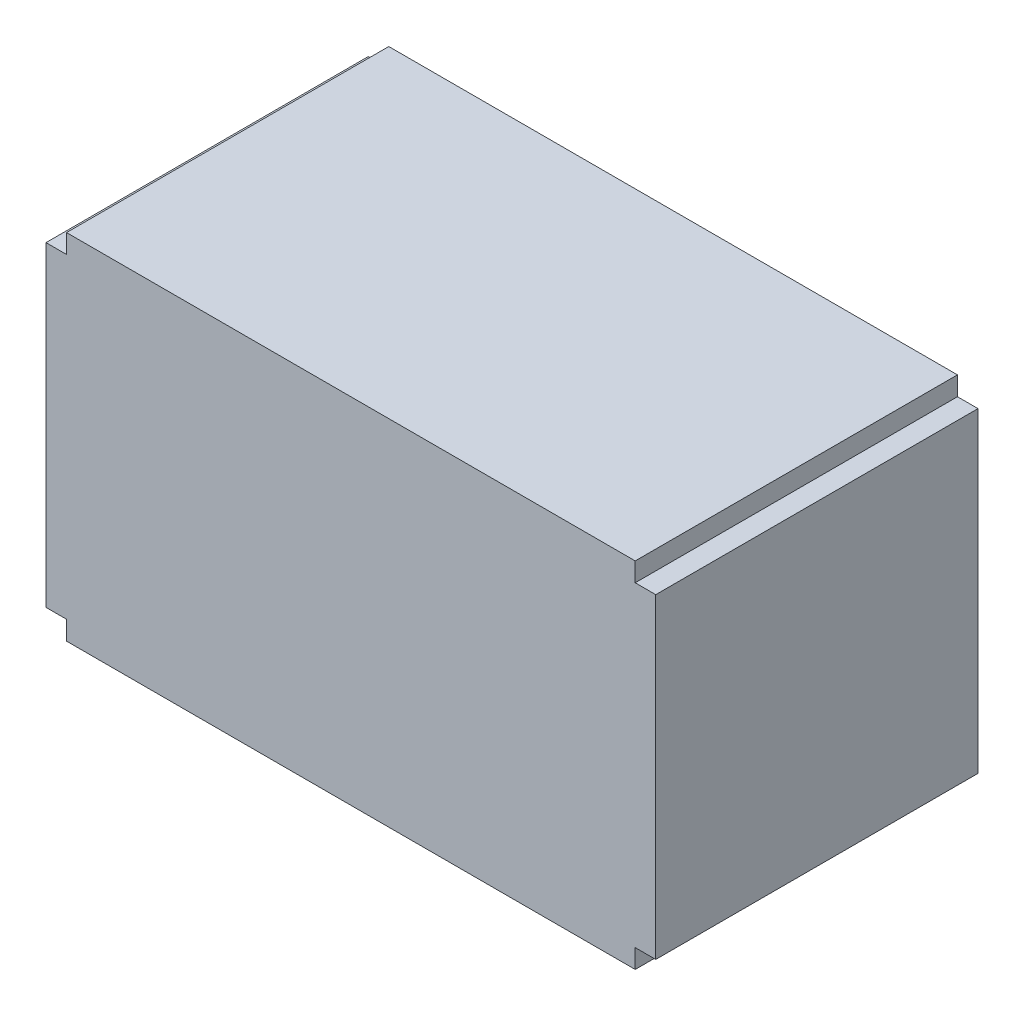
ISO-10303-21;
HEADER;
FILE_DESCRIPTION(('STEP AP214'),'2;1');
FILE_NAME('part.step','',(''),(''),'','','');
FILE_SCHEMA(('AUTOMOTIVE_DESIGN { 1 0 10303 214 1 1 1 1 }'));
ENDSEC;
DATA;
#1=APPLICATION_CONTEXT('core data for automotive mechanical design processes');
#2=APPLICATION_PROTOCOL_DEFINITION('international standard','automotive_design',2000,#1);
#3=PRODUCT_CONTEXT('',#1,'mechanical');
#4=PRODUCT('Part','Part','',(#3));
#5=PRODUCT_RELATED_PRODUCT_CATEGORY('part','',(#4));
#6=PRODUCT_DEFINITION_FORMATION('','',#4);
#7=PRODUCT_DEFINITION_CONTEXT('part definition',#1,'design');
#8=PRODUCT_DEFINITION('design','',#6,#7);
#9=PRODUCT_DEFINITION_SHAPE('','',#8);
#10=(LENGTH_UNIT() NAMED_UNIT(*) SI_UNIT(.MILLI.,.METRE.));
#11=(NAMED_UNIT(*) PLANE_ANGLE_UNIT() SI_UNIT($,.RADIAN.));
#12=(NAMED_UNIT(*) SI_UNIT($,.STERADIAN.) SOLID_ANGLE_UNIT());
#13=UNCERTAINTY_MEASURE_WITH_UNIT(LENGTH_MEASURE(1.E-05),#10,'distance_accuracy_value','');
#14=(GEOMETRIC_REPRESENTATION_CONTEXT(3) GLOBAL_UNCERTAINTY_ASSIGNED_CONTEXT((#13)) GLOBAL_UNIT_ASSIGNED_CONTEXT((#10,
#11,#12)) REPRESENTATION_CONTEXT('',''));
#15=CARTESIAN_POINT('',(0.,0.,0.));
#16=DIRECTION('',(0.,0.,1.));
#17=DIRECTION('',(1.,0.,0.));
#18=AXIS2_PLACEMENT_3D('',#15,#16,#17);
#19=CARTESIAN_POINT('',(0.965,0.5,1.02));
#20=DIRECTION('',(-1.,0.,0.));
#21=DIRECTION('',(0.,0.,1.));
#22=AXIS2_PLACEMENT_3D('',#19,#20,#21);
#23=PLANE('',#22);
#24=DIRECTION('',(0.,1.,0.));
#25=VECTOR('',#24,1.);
#26=CARTESIAN_POINT('',(0.965,0.5,0.));
#27=LINE('',#26,#25);
#28=CARTESIAN_POINT('',(0.965,-0.5,0.));
#29=VERTEX_POINT('',#28);
#30=CARTESIAN_POINT('',(0.965,0.5,0.));
#31=VERTEX_POINT('',#30);
#32=EDGE_CURVE('E154',#29,#31,#27,.T.);
#33=ORIENTED_EDGE('',*,*,#32,.T.);
#34=DIRECTION('',(0.,0.,-1.));
#35=VECTOR('',#34,1.);
#36=CARTESIAN_POINT('',(0.965,0.5,1.02));
#37=LINE('',#36,#35);
#38=CARTESIAN_POINT('',(0.965,0.5,1.02));
#39=VERTEX_POINT('',#38);
#40=EDGE_CURVE('E11',#39,#31,#37,.T.);
#41=ORIENTED_EDGE('',*,*,#40,.F.);
#42=DIRECTION('',(0.,1.,0.));
#43=VECTOR('',#42,1.);
#44=CARTESIAN_POINT('',(0.965,0.5,1.02));
#45=LINE('',#44,#43);
#46=CARTESIAN_POINT('',(0.965,-0.5,1.02));
#47=VERTEX_POINT('',#46);
#48=EDGE_CURVE('E176',#47,#39,#45,.T.);
#49=ORIENTED_EDGE('',*,*,#48,.F.);
#50=DIRECTION('',(0.,0.,-1.));
#51=VECTOR('',#50,1.);
#52=CARTESIAN_POINT('',(0.965,-0.5,1.02));
#53=LINE('',#52,#51);
#54=EDGE_CURVE('E150',#47,#29,#53,.T.);
#55=ORIENTED_EDGE('',*,*,#54,.T.);
#56=EDGE_LOOP('',(#33,#41,#49,#55));
#57=FACE_BOUND('',#56,.T.);
#58=ADVANCED_FACE('F34',(#57),#23,.F.);
#59=CARTESIAN_POINT('',(0.9,0.5,1.02));
#60=DIRECTION('',(0.,-1.,0.));
#61=DIRECTION('',(0.,0.,-1.));
#62=AXIS2_PLACEMENT_3D('',#59,#60,#61);
#63=PLANE('',#62);
#64=DIRECTION('',(-1.,0.,0.));
#65=VECTOR('',#64,1.);
#66=CARTESIAN_POINT('',(0.9,0.5,0.));
#67=LINE('',#66,#65);
#68=CARTESIAN_POINT('',(0.9,0.5,0.));
#69=VERTEX_POINT('',#68);
#70=EDGE_CURVE('E157',#31,#69,#67,.T.);
#71=ORIENTED_EDGE('',*,*,#70,.T.);
#72=DIRECTION('',(0.,0.,-1.));
#73=VECTOR('',#72,1.);
#74=CARTESIAN_POINT('',(0.9,0.5,1.02));
#75=LINE('',#74,#73);
#76=CARTESIAN_POINT('',(0.9,0.5,1.02));
#77=VERTEX_POINT('',#76);
#78=EDGE_CURVE('E42',#77,#69,#75,.T.);
#79=ORIENTED_EDGE('',*,*,#78,.F.);
#80=DIRECTION('',(-1.,0.,0.));
#81=VECTOR('',#80,1.);
#82=CARTESIAN_POINT('',(0.9,0.5,1.02));
#83=LINE('',#82,#81);
#84=EDGE_CURVE('E105',#39,#77,#83,.T.);
#85=ORIENTED_EDGE('',*,*,#84,.F.);
#86=ORIENTED_EDGE('',*,*,#40,.T.);
#87=EDGE_LOOP('',(#71,#79,#85,#86));
#88=FACE_BOUND('',#87,.T.);
#89=ADVANCED_FACE('F254',(#88),#63,.F.);
#90=CARTESIAN_POINT('',(0.9,0.56,1.02));
#91=DIRECTION('',(-1.,0.,0.));
#92=DIRECTION('',(0.,0.,1.));
#93=AXIS2_PLACEMENT_3D('',#90,#91,#92);
#94=PLANE('',#93);
#95=DIRECTION('',(0.,1.,0.));
#96=VECTOR('',#95,1.);
#97=CARTESIAN_POINT('',(0.9,0.56,0.));
#98=LINE('',#97,#96);
#99=CARTESIAN_POINT('',(0.9,0.56,0.));
#100=VERTEX_POINT('',#99);
#101=EDGE_CURVE('E159',#69,#100,#98,.T.);
#102=ORIENTED_EDGE('',*,*,#101,.T.);
#103=DIRECTION('',(0.,0.,-1.));
#104=VECTOR('',#103,1.);
#105=CARTESIAN_POINT('',(0.9,0.56,1.02));
#106=LINE('',#105,#104);
#107=CARTESIAN_POINT('',(0.9,0.56,1.02));
#108=VERTEX_POINT('',#107);
#109=EDGE_CURVE('E195',#108,#100,#106,.T.);
#110=ORIENTED_EDGE('',*,*,#109,.F.);
#111=DIRECTION('',(0.,1.,0.));
#112=VECTOR('',#111,1.);
#113=CARTESIAN_POINT('',(0.9,0.56,1.02));
#114=LINE('',#113,#112);
#115=EDGE_CURVE('E203',#77,#108,#114,.T.);
#116=ORIENTED_EDGE('',*,*,#115,.F.);
#117=ORIENTED_EDGE('',*,*,#78,.T.);
#118=EDGE_LOOP('',(#102,#110,#116,#117));
#119=FACE_BOUND('',#118,.T.);
#120=ADVANCED_FACE('F201',(#119),#94,.F.);
#121=CARTESIAN_POINT('',(-0.9,0.56,1.02));
#122=DIRECTION('',(0.,-1.,0.));
#123=DIRECTION('',(0.,0.,-1.));
#124=AXIS2_PLACEMENT_3D('',#121,#122,#123);
#125=PLANE('',#124);
#126=DIRECTION('',(-1.,0.,0.));
#127=VECTOR('',#126,1.);
#128=CARTESIAN_POINT('',(-0.9,0.56,0.));
#129=LINE('',#128,#127);
#130=CARTESIAN_POINT('',(-0.9,0.56,0.));
#131=VERTEX_POINT('',#130);
#132=EDGE_CURVE('E161',#100,#131,#129,.T.);
#133=ORIENTED_EDGE('',*,*,#132,.T.);
#134=DIRECTION('',(0.,0.,-1.));
#135=VECTOR('',#134,1.);
#136=CARTESIAN_POINT('',(-0.9,0.56,1.02));
#137=LINE('',#136,#135);
#138=CARTESIAN_POINT('',(-0.9,0.56,1.02));
#139=VERTEX_POINT('',#138);
#140=EDGE_CURVE('E192',#139,#131,#137,.T.);
#141=ORIENTED_EDGE('',*,*,#140,.F.);
#142=DIRECTION('',(-1.,0.,0.));
#143=VECTOR('',#142,1.);
#144=CARTESIAN_POINT('',(-0.9,0.56,1.02));
#145=LINE('',#144,#143);
#146=EDGE_CURVE('E221',#108,#139,#145,.T.);
#147=ORIENTED_EDGE('',*,*,#146,.F.);
#148=ORIENTED_EDGE('',*,*,#109,.T.);
#149=EDGE_LOOP('',(#133,#141,#147,#148));
#150=FACE_BOUND('',#149,.T.);
#151=ADVANCED_FACE('F212',(#150),#125,.F.);
#152=CARTESIAN_POINT('',(-0.9,0.5,1.02));
#153=DIRECTION('',(1.,0.,0.));
#154=DIRECTION('',(0.,0.,-1.));
#155=AXIS2_PLACEMENT_3D('',#152,#153,#154);
#156=PLANE('',#155);
#157=DIRECTION('',(0.,-1.,0.));
#158=VECTOR('',#157,1.);
#159=CARTESIAN_POINT('',(-0.9,0.5,0.));
#160=LINE('',#159,#158);
#161=CARTESIAN_POINT('',(-0.9,0.5,0.));
#162=VERTEX_POINT('',#161);
#163=EDGE_CURVE('E163',#131,#162,#160,.T.);
#164=ORIENTED_EDGE('',*,*,#163,.T.);
#165=DIRECTION('',(0.,0.,-1.));
#166=VECTOR('',#165,1.);
#167=CARTESIAN_POINT('',(-0.9,0.5,1.02));
#168=LINE('',#167,#166);
#169=CARTESIAN_POINT('',(-0.9,0.5,1.02));
#170=VERTEX_POINT('',#169);
#171=EDGE_CURVE('E189',#170,#162,#168,.T.);
#172=ORIENTED_EDGE('',*,*,#171,.F.);
#173=DIRECTION('',(0.,-1.,0.));
#174=VECTOR('',#173,1.);
#175=CARTESIAN_POINT('',(-0.9,0.5,1.02));
#176=LINE('',#175,#174);
#177=EDGE_CURVE('E218',#139,#170,#176,.T.);
#178=ORIENTED_EDGE('',*,*,#177,.F.);
#179=ORIENTED_EDGE('',*,*,#140,.T.);
#180=EDGE_LOOP('',(#164,#172,#178,#179));
#181=FACE_BOUND('',#180,.T.);
#182=ADVANCED_FACE('F216',(#181),#156,.F.);
#183=CARTESIAN_POINT('',(-0.965,0.5,1.02));
#184=DIRECTION('',(0.,-1.,0.));
#185=DIRECTION('',(0.,0.,-1.));
#186=AXIS2_PLACEMENT_3D('',#183,#184,#185);
#187=PLANE('',#186);
#188=DIRECTION('',(-1.,0.,0.));
#189=VECTOR('',#188,1.);
#190=CARTESIAN_POINT('',(-0.965,0.5,0.));
#191=LINE('',#190,#189);
#192=CARTESIAN_POINT('',(-0.965,0.5,0.));
#193=VERTEX_POINT('',#192);
#194=EDGE_CURVE('E165',#162,#193,#191,.T.);
#195=ORIENTED_EDGE('',*,*,#194,.T.);
#196=DIRECTION('',(0.,0.,-1.));
#197=VECTOR('',#196,1.);
#198=CARTESIAN_POINT('',(-0.965,0.5,1.02));
#199=LINE('',#198,#197);
#200=CARTESIAN_POINT('',(-0.965,0.5,1.02));
#201=VERTEX_POINT('',#200);
#202=EDGE_CURVE('E186',#201,#193,#199,.T.);
#203=ORIENTED_EDGE('',*,*,#202,.F.);
#204=DIRECTION('',(-1.,0.,0.));
#205=VECTOR('',#204,1.);
#206=CARTESIAN_POINT('',(-0.965,0.5,1.02));
#207=LINE('',#206,#205);
#208=EDGE_CURVE('E220',#170,#201,#207,.T.);
#209=ORIENTED_EDGE('',*,*,#208,.F.);
#210=ORIENTED_EDGE('',*,*,#171,.T.);
#211=EDGE_LOOP('',(#195,#203,#209,#210));
#212=FACE_BOUND('',#211,.T.);
#213=ADVANCED_FACE('F267',(#212),#187,.F.);
#214=CARTESIAN_POINT('',(-0.965,-0.5,1.02));
#215=DIRECTION('',(1.,0.,0.));
#216=DIRECTION('',(0.,0.,-1.));
#217=AXIS2_PLACEMENT_3D('',#214,#215,#216);
#218=PLANE('',#217);
#219=DIRECTION('',(0.,-1.,0.));
#220=VECTOR('',#219,1.);
#221=CARTESIAN_POINT('',(-0.965,-0.5,0.));
#222=LINE('',#221,#220);
#223=CARTESIAN_POINT('',(-0.965,-0.5,0.));
#224=VERTEX_POINT('',#223);
#225=EDGE_CURVE('E167',#193,#224,#222,.T.);
#226=ORIENTED_EDGE('',*,*,#225,.T.);
#227=DIRECTION('',(0.,0.,-1.));
#228=VECTOR('',#227,1.);
#229=CARTESIAN_POINT('',(-0.965,-0.5,1.02));
#230=LINE('',#229,#228);
#231=CARTESIAN_POINT('',(-0.965,-0.5,1.02));
#232=VERTEX_POINT('',#231);
#233=EDGE_CURVE('E183',#232,#224,#230,.T.);
#234=ORIENTED_EDGE('',*,*,#233,.F.);
#235=DIRECTION('',(0.,-1.,0.));
#236=VECTOR('',#235,1.);
#237=CARTESIAN_POINT('',(-0.965,-0.5,1.02));
#238=LINE('',#237,#236);
#239=EDGE_CURVE('E223',#201,#232,#238,.T.);
#240=ORIENTED_EDGE('',*,*,#239,.F.);
#241=ORIENTED_EDGE('',*,*,#202,.T.);
#242=EDGE_LOOP('',(#226,#234,#240,#241));
#243=FACE_BOUND('',#242,.T.);
#244=ADVANCED_FACE('F270',(#243),#218,.F.);
#245=CARTESIAN_POINT('',(-0.9,-0.5,1.02));
#246=DIRECTION('',(0.,1.,0.));
#247=DIRECTION('',(0.,0.,1.));
#248=AXIS2_PLACEMENT_3D('',#245,#246,#247);
#249=PLANE('',#248);
#250=DIRECTION('',(1.,0.,0.));
#251=VECTOR('',#250,1.);
#252=CARTESIAN_POINT('',(-0.9,-0.5,0.));
#253=LINE('',#252,#251);
#254=CARTESIAN_POINT('',(-0.9,-0.5,0.));
#255=VERTEX_POINT('',#254);
#256=EDGE_CURVE('E169',#224,#255,#253,.T.);
#257=ORIENTED_EDGE('',*,*,#256,.T.);
#258=DIRECTION('',(0.,0.,-1.));
#259=VECTOR('',#258,1.);
#260=CARTESIAN_POINT('',(-0.9,-0.5,1.02));
#261=LINE('',#260,#259);
#262=CARTESIAN_POINT('',(-0.9,-0.5,1.02));
#263=VERTEX_POINT('',#262);
#264=EDGE_CURVE('E180',#263,#255,#261,.T.);
#265=ORIENTED_EDGE('',*,*,#264,.F.);
#266=DIRECTION('',(1.,0.,0.));
#267=VECTOR('',#266,1.);
#268=CARTESIAN_POINT('',(-0.9,-0.5,1.02));
#269=LINE('',#268,#267);
#270=EDGE_CURVE('E229',#232,#263,#269,.T.);
#271=ORIENTED_EDGE('',*,*,#270,.F.);
#272=ORIENTED_EDGE('',*,*,#233,.T.);
#273=EDGE_LOOP('',(#257,#265,#271,#272));
#274=FACE_BOUND('',#273,.T.);
#275=ADVANCED_FACE('F235',(#274),#249,.F.);
#276=CARTESIAN_POINT('',(-0.9,-0.56,1.02));
#277=DIRECTION('',(1.,0.,0.));
#278=DIRECTION('',(0.,0.,-1.));
#279=AXIS2_PLACEMENT_3D('',#276,#277,#278);
#280=PLANE('',#279);
#281=DIRECTION('',(0.,-1.,0.));
#282=VECTOR('',#281,1.);
#283=CARTESIAN_POINT('',(-0.9,-0.56,0.));
#284=LINE('',#283,#282);
#285=CARTESIAN_POINT('',(-0.9,-0.56,0.));
#286=VERTEX_POINT('',#285);
#287=EDGE_CURVE('E171',#255,#286,#284,.T.);
#288=ORIENTED_EDGE('',*,*,#287,.T.);
#289=DIRECTION('',(0.,0.,-1.));
#290=VECTOR('',#289,1.);
#291=CARTESIAN_POINT('',(-0.9,-0.56,1.02));
#292=LINE('',#291,#290);
#293=CARTESIAN_POINT('',(-0.9,-0.56,1.02));
#294=VERTEX_POINT('',#293);
#295=EDGE_CURVE('E145',#294,#286,#292,.T.);
#296=ORIENTED_EDGE('',*,*,#295,.F.);
#297=DIRECTION('',(0.,-1.,0.));
#298=VECTOR('',#297,1.);
#299=CARTESIAN_POINT('',(-0.9,-0.56,1.02));
#300=LINE('',#299,#298);
#301=EDGE_CURVE('E136',#263,#294,#300,.T.);
#302=ORIENTED_EDGE('',*,*,#301,.F.);
#303=ORIENTED_EDGE('',*,*,#264,.T.);
#304=EDGE_LOOP('',(#288,#296,#302,#303));
#305=FACE_BOUND('',#304,.T.);
#306=ADVANCED_FACE('F239',(#305),#280,.F.);
#307=CARTESIAN_POINT('',(0.9,-0.56,1.02));
#308=DIRECTION('',(0.,1.,0.));
#309=DIRECTION('',(0.,0.,1.));
#310=AXIS2_PLACEMENT_3D('',#307,#308,#309);
#311=PLANE('',#310);
#312=DIRECTION('',(1.,0.,0.));
#313=VECTOR('',#312,1.);
#314=CARTESIAN_POINT('',(0.9,-0.56,0.));
#315=LINE('',#314,#313);
#316=CARTESIAN_POINT('',(0.9,-0.56,0.));
#317=VERTEX_POINT('',#316);
#318=EDGE_CURVE('E144',#286,#317,#315,.T.);
#319=ORIENTED_EDGE('',*,*,#318,.T.);
#320=DIRECTION('',(0.,0.,-1.));
#321=VECTOR('',#320,1.);
#322=CARTESIAN_POINT('',(0.9,-0.56,1.02));
#323=LINE('',#322,#321);
#324=CARTESIAN_POINT('',(0.9,-0.56,1.02));
#325=VERTEX_POINT('',#324);
#326=EDGE_CURVE('E141',#325,#317,#323,.T.);
#327=ORIENTED_EDGE('',*,*,#326,.F.);
#328=DIRECTION('',(1.,0.,0.));
#329=VECTOR('',#328,1.);
#330=CARTESIAN_POINT('',(0.9,-0.56,1.02));
#331=LINE('',#330,#329);
#332=EDGE_CURVE('E130',#294,#325,#331,.T.);
#333=ORIENTED_EDGE('',*,*,#332,.F.);
#334=ORIENTED_EDGE('',*,*,#295,.T.);
#335=EDGE_LOOP('',(#319,#327,#333,#334));
#336=FACE_BOUND('',#335,.T.);
#337=ADVANCED_FACE('F142',(#336),#311,.F.);
#338=CARTESIAN_POINT('',(0.9,-0.5,1.02));
#339=DIRECTION('',(-1.,0.,0.));
#340=DIRECTION('',(0.,0.,1.));
#341=AXIS2_PLACEMENT_3D('',#338,#339,#340);
#342=PLANE('',#341);
#343=DIRECTION('',(0.,1.,0.));
#344=VECTOR('',#343,1.);
#345=CARTESIAN_POINT('',(0.9,-0.5,0.));
#346=LINE('',#345,#344);
#347=CARTESIAN_POINT('',(0.9,-0.5,0.));
#348=VERTEX_POINT('',#347);
#349=EDGE_CURVE('E91',#317,#348,#346,.T.);
#350=ORIENTED_EDGE('',*,*,#349,.T.);
#351=DIRECTION('',(0.,0.,-1.));
#352=VECTOR('',#351,1.);
#353=CARTESIAN_POINT('',(0.9,-0.5,1.02));
#354=LINE('',#353,#352);
#355=CARTESIAN_POINT('',(0.9,-0.5,1.02));
#356=VERTEX_POINT('',#355);
#357=EDGE_CURVE('E146',#356,#348,#354,.T.);
#358=ORIENTED_EDGE('',*,*,#357,.F.);
#359=DIRECTION('',(0.,1.,0.));
#360=VECTOR('',#359,1.);
#361=CARTESIAN_POINT('',(0.9,-0.5,1.02));
#362=LINE('',#361,#360);
#363=EDGE_CURVE('E134',#325,#356,#362,.T.);
#364=ORIENTED_EDGE('',*,*,#363,.F.);
#365=ORIENTED_EDGE('',*,*,#326,.T.);
#366=EDGE_LOOP('',(#350,#358,#364,#365));
#367=FACE_BOUND('',#366,.T.);
#368=ADVANCED_FACE('F148',(#367),#342,.F.);
#369=CARTESIAN_POINT('',(0.965,-0.5,1.02));
#370=DIRECTION('',(0.,1.,0.));
#371=DIRECTION('',(0.,0.,1.));
#372=AXIS2_PLACEMENT_3D('',#369,#370,#371);
#373=PLANE('',#372);
#374=DIRECTION('',(1.,0.,0.));
#375=VECTOR('',#374,1.);
#376=CARTESIAN_POINT('',(0.965,-0.5,0.));
#377=LINE('',#376,#375);
#378=EDGE_CURVE('E97',#348,#29,#377,.T.);
#379=ORIENTED_EDGE('',*,*,#378,.T.);
#380=ORIENTED_EDGE('',*,*,#54,.F.);
#381=DIRECTION('',(1.,0.,0.));
#382=VECTOR('',#381,1.);
#383=CARTESIAN_POINT('',(0.965,-0.5,1.02));
#384=LINE('',#383,#382);
#385=EDGE_CURVE('E50',#356,#47,#384,.T.);
#386=ORIENTED_EDGE('',*,*,#385,.F.);
#387=ORIENTED_EDGE('',*,*,#357,.T.);
#388=EDGE_LOOP('',(#379,#380,#386,#387));
#389=FACE_BOUND('',#388,.T.);
#390=ADVANCED_FACE('F243',(#389),#373,.F.);
#391=CARTESIAN_POINT('',(0.,0.,1.02));
#392=DIRECTION('',(0.,0.,-1.));
#393=DIRECTION('',(-1.,0.,0.));
#394=AXIS2_PLACEMENT_3D('',#391,#392,#393);
#395=PLANE('',#394);
#396=ORIENTED_EDGE('',*,*,#48,.T.);
#397=ORIENTED_EDGE('',*,*,#84,.T.);
#398=ORIENTED_EDGE('',*,*,#115,.T.);
#399=ORIENTED_EDGE('',*,*,#146,.T.);
#400=ORIENTED_EDGE('',*,*,#177,.T.);
#401=ORIENTED_EDGE('',*,*,#208,.T.);
#402=ORIENTED_EDGE('',*,*,#239,.T.);
#403=ORIENTED_EDGE('',*,*,#270,.T.);
#404=ORIENTED_EDGE('',*,*,#301,.T.);
#405=ORIENTED_EDGE('',*,*,#332,.T.);
#406=ORIENTED_EDGE('',*,*,#363,.T.);
#407=ORIENTED_EDGE('',*,*,#385,.T.);
#408=EDGE_LOOP('',(#396,#397,#398,#399,#400,#401,#402,#403,#404,#405,#406,#407));
#409=FACE_BOUND('',#408,.T.);
#410=ADVANCED_FACE('F132',(#409),#395,.F.);
#411=CARTESIAN_POINT('',(0.,0.,0.));
#412=DIRECTION('',(0.,0.,-1.));
#413=DIRECTION('',(-1.,0.,0.));
#414=AXIS2_PLACEMENT_3D('',#411,#412,#413);
#415=PLANE('',#414);
#416=ORIENTED_EDGE('',*,*,#32,.F.);
#417=ORIENTED_EDGE('',*,*,#378,.F.);
#418=ORIENTED_EDGE('',*,*,#349,.F.);
#419=ORIENTED_EDGE('',*,*,#318,.F.);
#420=ORIENTED_EDGE('',*,*,#287,.F.);
#421=ORIENTED_EDGE('',*,*,#256,.F.);
#422=ORIENTED_EDGE('',*,*,#225,.F.);
#423=ORIENTED_EDGE('',*,*,#194,.F.);
#424=ORIENTED_EDGE('',*,*,#163,.F.);
#425=ORIENTED_EDGE('',*,*,#132,.F.);
#426=ORIENTED_EDGE('',*,*,#101,.F.);
#427=ORIENTED_EDGE('',*,*,#70,.F.);
#428=EDGE_LOOP('',(#416,#417,#418,#419,#420,#421,#422,#423,#424,#425,#426,#427));
#429=FACE_BOUND('',#428,.T.);
#430=ADVANCED_FACE('F207',(#429),#415,.T.);
#431=CLOSED_SHELL('',(#58,#89,#120,#151,#182,#213,#244,#275,#306,#337,#368,#390,#410,#430));
#432=MANIFOLD_SOLID_BREP('B2',#431);
#433=ADVANCED_BREP_SHAPE_REPRESENTATION('',(#18,#432),#14);
#434=SHAPE_DEFINITION_REPRESENTATION(#9,#433);
ENDSEC;
END-ISO-10303-21;
